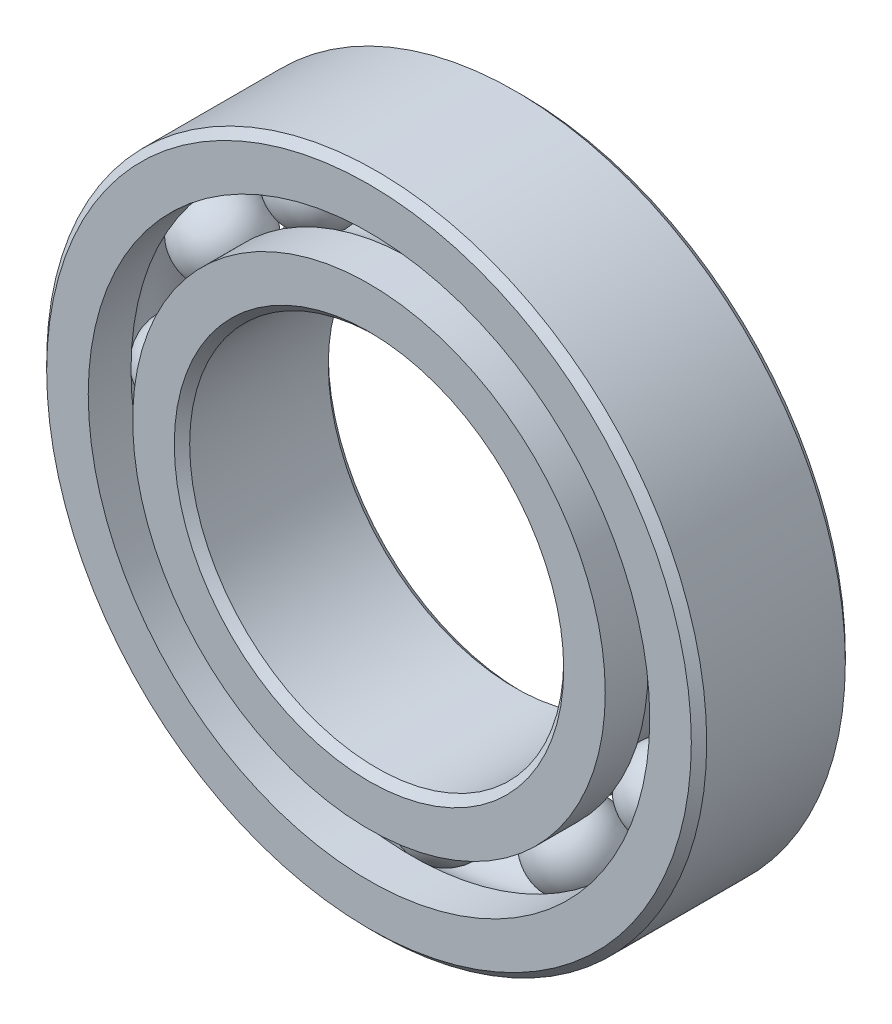
ISO-10303-21;
HEADER;
FILE_DESCRIPTION(('STEP AP214'),'2;1');
FILE_NAME('part.step','',(''),(''),'','','');
FILE_SCHEMA(('AUTOMOTIVE_DESIGN { 1 0 10303 214 1 1 1 1 }'));
ENDSEC;
DATA;
#1=APPLICATION_CONTEXT('core data for automotive mechanical design processes');
#2=APPLICATION_PROTOCOL_DEFINITION('international standard','automotive_design',2000,#1);
#3=PRODUCT_CONTEXT('',#1,'mechanical');
#4=PRODUCT('Part','Part','',(#3));
#5=PRODUCT_RELATED_PRODUCT_CATEGORY('part','',(#4));
#6=PRODUCT_DEFINITION_FORMATION('','',#4);
#7=PRODUCT_DEFINITION_CONTEXT('part definition',#1,'design');
#8=PRODUCT_DEFINITION('design','',#6,#7);
#9=PRODUCT_DEFINITION_SHAPE('','',#8);
#10=(LENGTH_UNIT() NAMED_UNIT(*) SI_UNIT(.MILLI.,.METRE.));
#11=(NAMED_UNIT(*) PLANE_ANGLE_UNIT() SI_UNIT($,.RADIAN.));
#12=(NAMED_UNIT(*) SI_UNIT($,.STERADIAN.) SOLID_ANGLE_UNIT());
#13=UNCERTAINTY_MEASURE_WITH_UNIT(LENGTH_MEASURE(1.E-05),#10,'distance_accuracy_value','');
#14=(GEOMETRIC_REPRESENTATION_CONTEXT(3) GLOBAL_UNCERTAINTY_ASSIGNED_CONTEXT((#13)) GLOBAL_UNIT_ASSIGNED_CONTEXT((#10,
#11,#12)) REPRESENTATION_CONTEXT('',''));
#15=CARTESIAN_POINT('',(0.,0.,0.));
#16=DIRECTION('',(0.,0.,1.));
#17=DIRECTION('',(1.,0.,0.));
#18=AXIS2_PLACEMENT_3D('',#15,#16,#17);
#19=CARTESIAN_POINT('',(-5.87499999999987,10.1757984944672,0.));
#20=DIRECTION('',(0.,0.,1.));
#21=DIRECTION('',(-0.499999999999989,0.866025403784445,0.));
#22=AXIS2_PLACEMENT_3D('',#19,#20,#21);
#23=SPHERICAL_SURFACE('',#22,1.85522286175011);
#24=CARTESIAN_POINT('',(-5.87499999999987,10.1757984944672,1.85522286175011));
#25=VERTEX_POINT('',#24);
#26=VERTEX_LOOP('',#25);
#27=FACE_BOUND('',#26,.T.);
#28=ADVANCED_FACE('F42',(#27),#23,.T.);
#29=CLOSED_SHELL('',(#28));
#30=MANIFOLD_SOLID_BREP('B2',#29);
#31=CARTESIAN_POINT('',(-10.1757984944671,5.87500000000012,0.));
#32=DIRECTION('',(0.,0.,1.));
#33=DIRECTION('',(-0.866025403784433,0.50000000000001,0.));
#34=AXIS2_PLACEMENT_3D('',#31,#32,#33);
#35=SPHERICAL_SURFACE('',#34,1.85522286175011);
#36=CARTESIAN_POINT('',(-10.1757984944671,5.87500000000012,1.85522286175011));
#37=VERTEX_POINT('',#36);
#38=VERTEX_LOOP('',#37);
#39=FACE_BOUND('',#38,.T.);
#40=ADVANCED_FACE('F63',(#39),#35,.T.);
#41=CLOSED_SHELL('',(#40));
#42=MANIFOLD_SOLID_BREP('B6',#41);
#43=CARTESIAN_POINT('',(-11.75,1.2307471719422E-13,0.));
#44=DIRECTION('',(0.,0.,1.));
#45=DIRECTION('',(-1.,0.,0.));
#46=AXIS2_PLACEMENT_3D('',#43,#44,#45);
#47=SPHERICAL_SURFACE('',#46,1.85522286175011);
#48=CARTESIAN_POINT('',(-11.75,1.2307471719422E-13,1.85522286175011));
#49=VERTEX_POINT('',#48);
#50=VERTEX_LOOP('',#49);
#51=FACE_BOUND('',#50,.T.);
#52=ADVANCED_FACE('F84',(#51),#47,.T.);
#53=CLOSED_SHELL('',(#52));
#54=MANIFOLD_SOLID_BREP('B38',#53);
#55=CARTESIAN_POINT('',(-10.1757984944672,-5.87499999999991,0.));
#56=DIRECTION('',(0.,0.,1.));
#57=DIRECTION('',(-0.866025403784443,-0.499999999999992,0.));
#58=AXIS2_PLACEMENT_3D('',#55,#56,#57);
#59=SPHERICAL_SURFACE('',#58,1.85522286175011);
#60=CARTESIAN_POINT('',(-10.1757984944672,-5.87499999999991,1.85522286175011));
#61=VERTEX_POINT('',#60);
#62=VERTEX_LOOP('',#61);
#63=FACE_BOUND('',#62,.T.);
#64=ADVANCED_FACE('F105',(#63),#59,.T.);
#65=CLOSED_SHELL('',(#64));
#66=MANIFOLD_SOLID_BREP('B59',#65);
#67=CARTESIAN_POINT('',(-5.87500000000008,-10.1757984944671,0.));
#68=DIRECTION('',(0.,0.,1.));
#69=DIRECTION('',(-0.500000000000007,-0.866025403784435,0.));
#70=AXIS2_PLACEMENT_3D('',#67,#68,#69);
#71=SPHERICAL_SURFACE('',#70,1.85522286175011);
#72=CARTESIAN_POINT('',(-5.87500000000008,-10.1757984944671,1.85522286175011));
#73=VERTEX_POINT('',#72);
#74=VERTEX_LOOP('',#73);
#75=FACE_BOUND('',#74,.T.);
#76=ADVANCED_FACE('F126',(#75),#71,.T.);
#77=CLOSED_SHELL('',(#76));
#78=MANIFOLD_SOLID_BREP('B80',#77);
#79=CARTESIAN_POINT('',(0.,-11.75,0.));
#80=DIRECTION('',(0.,0.,1.));
#81=DIRECTION('',(0.,-1.,0.));
#82=AXIS2_PLACEMENT_3D('',#79,#80,#81);
#83=SPHERICAL_SURFACE('',#82,1.85522286175011);
#84=CARTESIAN_POINT('',(0.,-11.75,1.85522286175011));
#85=VERTEX_POINT('',#84);
#86=VERTEX_LOOP('',#85);
#87=FACE_BOUND('',#86,.T.);
#88=ADVANCED_FACE('F147',(#87),#83,.T.);
#89=CLOSED_SHELL('',(#88));
#90=MANIFOLD_SOLID_BREP('B101',#89);
#91=CARTESIAN_POINT('',(5.87499999999994,-10.1757984944672,0.));
#92=DIRECTION('',(0.,0.,1.));
#93=DIRECTION('',(0.499999999999995,-0.866025403784442,0.));
#94=AXIS2_PLACEMENT_3D('',#91,#92,#93);
#95=SPHERICAL_SURFACE('',#94,1.85522286175011);
#96=CARTESIAN_POINT('',(5.87499999999994,-10.1757984944672,1.85522286175011));
#97=VERTEX_POINT('',#96);
#98=VERTEX_LOOP('',#97);
#99=FACE_BOUND('',#98,.T.);
#100=ADVANCED_FACE('F168',(#99),#95,.T.);
#101=CLOSED_SHELL('',(#100));
#102=MANIFOLD_SOLID_BREP('B122',#101);
#103=CARTESIAN_POINT('',(10.1757984944671,-5.87500000000005,0.));
#104=DIRECTION('',(0.,0.,1.));
#105=DIRECTION('',(0.866025403784436,-0.500000000000004,0.));
#106=AXIS2_PLACEMENT_3D('',#103,#104,#105);
#107=SPHERICAL_SURFACE('',#106,1.85522286175011);
#108=CARTESIAN_POINT('',(10.1757984944671,-5.87500000000005,1.85522286175011));
#109=VERTEX_POINT('',#108);
#110=VERTEX_LOOP('',#109);
#111=FACE_BOUND('',#110,.T.);
#112=ADVANCED_FACE('F189',(#111),#107,.T.);
#113=CLOSED_SHELL('',(#112));
#114=MANIFOLD_SOLID_BREP('B143',#113);
#115=CARTESIAN_POINT('',(11.75,0.,0.));
#116=DIRECTION('',(0.,0.,1.));
#117=DIRECTION('',(1.,0.,0.));
#118=AXIS2_PLACEMENT_3D('',#115,#116,#117);
#119=SPHERICAL_SURFACE('',#118,1.85522286175011);
#120=CARTESIAN_POINT('',(11.75,0.,1.85522286175011));
#121=VERTEX_POINT('',#120);
#122=VERTEX_LOOP('',#121);
#123=FACE_BOUND('',#122,.T.);
#124=ADVANCED_FACE('F210',(#123),#119,.T.);
#125=CLOSED_SHELL('',(#124));
#126=MANIFOLD_SOLID_BREP('B164',#125);
#127=CARTESIAN_POINT('',(10.1757984944672,5.87499999999998,0.));
#128=DIRECTION('',(0.,0.,1.));
#129=DIRECTION('',(0.86602540378444,0.499999999999998,0.));
#130=AXIS2_PLACEMENT_3D('',#127,#128,#129);
#131=SPHERICAL_SURFACE('',#130,1.85522286175011);
#132=CARTESIAN_POINT('',(10.1757984944672,5.87499999999998,1.85522286175011));
#133=VERTEX_POINT('',#132);
#134=VERTEX_LOOP('',#133);
#135=FACE_BOUND('',#134,.T.);
#136=ADVANCED_FACE('F231',(#135),#131,.T.);
#137=CLOSED_SHELL('',(#136));
#138=MANIFOLD_SOLID_BREP('B185',#137);
#139=CARTESIAN_POINT('',(5.87500000000001,10.1757984944671,0.));
#140=DIRECTION('',(0.,0.,1.));
#141=DIRECTION('',(0.500000000000001,0.866025403784438,0.));
#142=AXIS2_PLACEMENT_3D('',#139,#140,#141);
#143=SPHERICAL_SURFACE('',#142,1.85522286175011);
#144=CARTESIAN_POINT('',(5.87500000000001,10.1757984944671,1.85522286175011));
#145=VERTEX_POINT('',#144);
#146=VERTEX_LOOP('',#145);
#147=FACE_BOUND('',#146,.T.);
#148=ADVANCED_FACE('F252',(#147),#143,.T.);
#149=CLOSED_SHELL('',(#148));
#150=MANIFOLD_SOLID_BREP('B206',#149);
#151=CARTESIAN_POINT('',(0.,11.75,0.));
#152=DIRECTION('',(0.,0.,1.));
#153=DIRECTION('',(0.,1.,0.));
#154=AXIS2_PLACEMENT_3D('',#151,#152,#153);
#155=SPHERICAL_SURFACE('',#154,1.85522286175011);
#156=CARTESIAN_POINT('',(0.,11.75,1.85522286175011));
#157=VERTEX_POINT('',#156);
#158=VERTEX_LOOP('',#157);
#159=FACE_BOUND('',#158,.T.);
#160=ADVANCED_FACE('F275',(#159),#155,.T.);
#161=CLOSED_SHELL('',(#160));
#162=MANIFOLD_SOLID_BREP('B227',#161);
#163=CARTESIAN_POINT('',(0.,10.739010989011,3.5));
#164=DIRECTION('',(0.,0.,-1.));
#165=DIRECTION('',(-1.,0.,0.));
#166=AXIS2_PLACEMENT_3D('',#163,#164,#165);
#167=PLANE('',#166);
#168=CARTESIAN_POINT('',(0.,0.,3.5));
#169=DIRECTION('',(0.,0.,1.));
#170=DIRECTION('',(1.,0.,0.));
#171=AXIS2_PLACEMENT_3D('',#168,#169,#170);
#172=CIRCLE('',#171,8.85);
#173=CARTESIAN_POINT('',(8.85,0.,3.5));
#174=VERTEX_POINT('',#173);
#175=EDGE_CURVE('E323',#174,#174,#172,.T.);
#176=ORIENTED_EDGE('',*,*,#175,.F.);
#177=EDGE_LOOP('',(#176));
#178=FACE_BOUND('',#177,.T.);
#179=CARTESIAN_POINT('',(0.,0.,3.5));
#180=DIRECTION('',(0.,0.,1.));
#181=DIRECTION('',(1.,0.,0.));
#182=AXIS2_PLACEMENT_3D('',#179,#180,#181);
#183=CIRCLE('',#182,10.739010989011);
#184=CARTESIAN_POINT('',(10.739010989011,0.,3.5));
#185=VERTEX_POINT('',#184);
#186=EDGE_CURVE('E274',#185,#185,#183,.T.);
#187=ORIENTED_EDGE('',*,*,#186,.T.);
#188=EDGE_LOOP('',(#187));
#189=FACE_BOUND('',#188,.T.);
#190=ADVANCED_FACE('F295',(#178,#189),#167,.F.);
#191=CARTESIAN_POINT('',(0.,0.,3.5));
#192=DIRECTION('',(0.,0.,1.));
#193=DIRECTION('',(1.,0.,0.));
#194=AXIS2_PLACEMENT_3D('',#191,#192,#193);
#195=CYLINDRICAL_SURFACE('',#194,10.739010989011);
#196=ORIENTED_EDGE('',*,*,#186,.F.);
#197=EDGE_LOOP('',(#196));
#198=FACE_BOUND('',#197,.T.);
#199=CARTESIAN_POINT('',(0.,0.,1.55555555555555));
#200=DIRECTION('',(0.,0.,1.));
#201=DIRECTION('',(1.,0.,0.));
#202=AXIS2_PLACEMENT_3D('',#199,#200,#201);
#203=CIRCLE('',#202,10.739010989011);
#204=CARTESIAN_POINT('',(10.739010989011,0.,1.55555555555555));
#205=VERTEX_POINT('',#204);
#206=EDGE_CURVE('E301',#205,#205,#203,.T.);
#207=ORIENTED_EDGE('',*,*,#206,.T.);
#208=EDGE_LOOP('',(#207));
#209=FACE_BOUND('',#208,.T.);
#210=ADVANCED_FACE('F330',(#198,#209),#195,.T.);
#211=CARTESIAN_POINT('',(0.,0.,0.));
#212=DIRECTION('',(0.,0.,1.));
#213=DIRECTION('',(1.,0.,0.));
#214=AXIS2_PLACEMENT_3D('',#211,#212,#213);
#215=TOROIDAL_SURFACE('',#214,11.75,1.85522286175011);
#216=ORIENTED_EDGE('',*,*,#206,.F.);
#217=EDGE_LOOP('',(#216));
#218=FACE_BOUND('',#217,.T.);
#219=CARTESIAN_POINT('',(0.,0.,-1.55555555555556));
#220=DIRECTION('',(0.,0.,1.));
#221=DIRECTION('',(1.,0.,0.));
#222=AXIS2_PLACEMENT_3D('',#219,#220,#221);
#223=CIRCLE('',#222,10.739010989011);
#224=CARTESIAN_POINT('',(10.739010989011,0.,-1.55555555555556));
#225=VERTEX_POINT('',#224);
#226=EDGE_CURVE('E305',#225,#225,#223,.T.);
#227=ORIENTED_EDGE('',*,*,#226,.T.);
#228=EDGE_LOOP('',(#227));
#229=FACE_BOUND('',#228,.T.);
#230=ADVANCED_FACE('F334',(#218,#229),#215,.F.);
#231=CARTESIAN_POINT('',(0.,0.,3.5));
#232=DIRECTION('',(0.,0.,1.));
#233=DIRECTION('',(1.,0.,0.));
#234=AXIS2_PLACEMENT_3D('',#231,#232,#233);
#235=CYLINDRICAL_SURFACE('',#234,10.739010989011);
#236=ORIENTED_EDGE('',*,*,#226,.F.);
#237=EDGE_LOOP('',(#236));
#238=FACE_BOUND('',#237,.T.);
#239=CARTESIAN_POINT('',(0.,0.,-3.5));
#240=DIRECTION('',(0.,0.,1.));
#241=DIRECTION('',(1.,0.,0.));
#242=AXIS2_PLACEMENT_3D('',#239,#240,#241);
#243=CIRCLE('',#242,10.739010989011);
#244=CARTESIAN_POINT('',(10.739010989011,0.,-3.5));
#245=VERTEX_POINT('',#244);
#246=EDGE_CURVE('E309',#245,#245,#243,.T.);
#247=ORIENTED_EDGE('',*,*,#246,.T.);
#248=EDGE_LOOP('',(#247));
#249=FACE_BOUND('',#248,.T.);
#250=ADVANCED_FACE('F339',(#238,#249),#235,.T.);
#251=CARTESIAN_POINT('',(0.,8.85,-3.5));
#252=DIRECTION('',(0.,0.,1.));
#253=DIRECTION('',(1.,0.,0.));
#254=AXIS2_PLACEMENT_3D('',#251,#252,#253);
#255=PLANE('',#254);
#256=ORIENTED_EDGE('',*,*,#246,.F.);
#257=EDGE_LOOP('',(#256));
#258=FACE_BOUND('',#257,.T.);
#259=CARTESIAN_POINT('',(0.,0.,-3.5));
#260=DIRECTION('',(0.,0.,1.));
#261=DIRECTION('',(1.,0.,0.));
#262=AXIS2_PLACEMENT_3D('',#259,#260,#261);
#263=CIRCLE('',#262,8.85);
#264=CARTESIAN_POINT('',(8.85,0.,-3.5));
#265=VERTEX_POINT('',#264);
#266=EDGE_CURVE('E314',#265,#265,#263,.T.);
#267=ORIENTED_EDGE('',*,*,#266,.T.);
#268=EDGE_LOOP('',(#267));
#269=FACE_BOUND('',#268,.T.);
#270=ADVANCED_FACE('F345',(#258,#269),#255,.F.);
#271=CARTESIAN_POINT('',(0.,0.,-3.15));
#272=DIRECTION('',(0.,0.,-1.));
#273=DIRECTION('',(-1.,0.,0.));
#274=AXIS2_PLACEMENT_3D('',#271,#272,#273);
#275=CONICAL_SURFACE('',#274,8.5,0.785398163397443);
#276=ORIENTED_EDGE('',*,*,#266,.F.);
#277=EDGE_LOOP('',(#276));
#278=FACE_BOUND('',#277,.T.);
#279=CARTESIAN_POINT('',(0.,0.,-3.15));
#280=DIRECTION('',(0.,0.,1.));
#281=DIRECTION('',(1.,0.,0.));
#282=AXIS2_PLACEMENT_3D('',#279,#280,#281);
#283=CIRCLE('',#282,8.5);
#284=CARTESIAN_POINT('',(8.5,0.,-3.15));
#285=VERTEX_POINT('',#284);
#286=EDGE_CURVE('E317',#285,#285,#283,.T.);
#287=ORIENTED_EDGE('',*,*,#286,.T.);
#288=EDGE_LOOP('',(#287));
#289=FACE_BOUND('',#288,.T.);
#290=ADVANCED_FACE('F349',(#278,#289),#275,.F.);
#291=CARTESIAN_POINT('',(0.,0.,3.5));
#292=DIRECTION('',(0.,0.,1.));
#293=DIRECTION('',(1.,0.,0.));
#294=AXIS2_PLACEMENT_3D('',#291,#292,#293);
#295=CYLINDRICAL_SURFACE('',#294,8.5);
#296=ORIENTED_EDGE('',*,*,#286,.F.);
#297=EDGE_LOOP('',(#296));
#298=FACE_BOUND('',#297,.T.);
#299=CARTESIAN_POINT('',(0.,0.,3.15000000000001));
#300=DIRECTION('',(0.,0.,1.));
#301=DIRECTION('',(1.,0.,0.));
#302=AXIS2_PLACEMENT_3D('',#299,#300,#301);
#303=CIRCLE('',#302,8.5);
#304=CARTESIAN_POINT('',(8.5,0.,3.15000000000001));
#305=VERTEX_POINT('',#304);
#306=EDGE_CURVE('E320',#305,#305,#303,.T.);
#307=ORIENTED_EDGE('',*,*,#306,.T.);
#308=EDGE_LOOP('',(#307));
#309=FACE_BOUND('',#308,.T.);
#310=ADVANCED_FACE('F353',(#298,#309),#295,.F.);
#311=CARTESIAN_POINT('',(0.,0.,3.5));
#312=DIRECTION('',(0.,0.,1.));
#313=DIRECTION('',(1.,0.,0.));
#314=AXIS2_PLACEMENT_3D('',#311,#312,#313);
#315=CONICAL_SURFACE('',#314,8.85,0.785398163397457);
#316=ORIENTED_EDGE('',*,*,#306,.F.);
#317=EDGE_LOOP('',(#316));
#318=FACE_BOUND('',#317,.T.);
#319=ORIENTED_EDGE('',*,*,#175,.T.);
#320=EDGE_LOOP('',(#319));
#321=FACE_BOUND('',#320,.T.);
#322=ADVANCED_FACE('F327',(#318,#321),#315,.F.);
#323=CLOSED_SHELL('',(#190,#210,#230,#250,#270,#290,#310,#322));
#324=MANIFOLD_SOLID_BREP('B248',#323);
#325=CARTESIAN_POINT('',(0.,0.,3.15));
#326=DIRECTION('',(0.,0.,-1.));
#327=DIRECTION('',(-1.,0.,0.));
#328=AXIS2_PLACEMENT_3D('',#325,#326,#327);
#329=CONICAL_SURFACE('',#328,15.,0.785398163397445);
#330=CARTESIAN_POINT('',(0.,0.,3.5));
#331=DIRECTION('',(0.,0.,1.));
#332=DIRECTION('',(1.,0.,0.));
#333=AXIS2_PLACEMENT_3D('',#330,#331,#332);
#334=CIRCLE('',#333,14.65);
#335=CARTESIAN_POINT('',(14.65,0.,3.5));
#336=VERTEX_POINT('',#335);
#337=EDGE_CURVE('E445',#336,#336,#334,.T.);
#338=ORIENTED_EDGE('',*,*,#337,.F.);
#339=EDGE_LOOP('',(#338));
#340=FACE_BOUND('',#339,.T.);
#341=CARTESIAN_POINT('',(0.,0.,3.15));
#342=DIRECTION('',(0.,0.,1.));
#343=DIRECTION('',(1.,0.,0.));
#344=AXIS2_PLACEMENT_3D('',#341,#342,#343);
#345=CIRCLE('',#344,15.);
#346=CARTESIAN_POINT('',(15.,0.,3.15));
#347=VERTEX_POINT('',#346);
#348=EDGE_CURVE('E294',#347,#347,#345,.T.);
#349=ORIENTED_EDGE('',*,*,#348,.T.);
#350=EDGE_LOOP('',(#349));
#351=FACE_BOUND('',#350,.T.);
#352=ADVANCED_FACE('F417',(#340,#351),#329,.T.);
#353=CARTESIAN_POINT('',(0.,0.,3.5));
#354=DIRECTION('',(0.,0.,1.));
#355=DIRECTION('',(1.,0.,0.));
#356=AXIS2_PLACEMENT_3D('',#353,#354,#355);
#357=CYLINDRICAL_SURFACE('',#356,15.);
#358=ORIENTED_EDGE('',*,*,#348,.F.);
#359=EDGE_LOOP('',(#358));
#360=FACE_BOUND('',#359,.T.);
#361=CARTESIAN_POINT('',(0.,0.,-3.15));
#362=DIRECTION('',(0.,0.,1.));
#363=DIRECTION('',(1.,0.,0.));
#364=AXIS2_PLACEMENT_3D('',#361,#362,#363);
#365=CIRCLE('',#364,15.);
#366=CARTESIAN_POINT('',(15.,0.,-3.15));
#367=VERTEX_POINT('',#366);
#368=EDGE_CURVE('E423',#367,#367,#365,.T.);
#369=ORIENTED_EDGE('',*,*,#368,.T.);
#370=EDGE_LOOP('',(#369));
#371=FACE_BOUND('',#370,.T.);
#372=ADVANCED_FACE('F452',(#360,#371),#357,.T.);
#373=CARTESIAN_POINT('',(0.,0.,-3.5));
#374=DIRECTION('',(0.,0.,1.));
#375=DIRECTION('',(1.,0.,0.));
#376=AXIS2_PLACEMENT_3D('',#373,#374,#375);
#377=CONICAL_SURFACE('',#376,14.65,0.785398163397443);
#378=ORIENTED_EDGE('',*,*,#368,.F.);
#379=EDGE_LOOP('',(#378));
#380=FACE_BOUND('',#379,.T.);
#381=CARTESIAN_POINT('',(0.,0.,-3.5));
#382=DIRECTION('',(0.,0.,1.));
#383=DIRECTION('',(1.,0.,0.));
#384=AXIS2_PLACEMENT_3D('',#381,#382,#383);
#385=CIRCLE('',#384,14.65);
#386=CARTESIAN_POINT('',(14.65,0.,-3.5));
#387=VERTEX_POINT('',#386);
#388=EDGE_CURVE('E427',#387,#387,#385,.T.);
#389=ORIENTED_EDGE('',*,*,#388,.T.);
#390=EDGE_LOOP('',(#389));
#391=FACE_BOUND('',#390,.T.);
#392=ADVANCED_FACE('F456',(#380,#391),#377,.T.);
#393=CARTESIAN_POINT('',(0.,14.65,-3.5));
#394=DIRECTION('',(0.,0.,1.));
#395=DIRECTION('',(1.,0.,0.));
#396=AXIS2_PLACEMENT_3D('',#393,#394,#395);
#397=PLANE('',#396);
#398=ORIENTED_EDGE('',*,*,#388,.F.);
#399=EDGE_LOOP('',(#398));
#400=FACE_BOUND('',#399,.T.);
#401=CARTESIAN_POINT('',(0.,0.,-3.5));
#402=DIRECTION('',(0.,0.,1.));
#403=DIRECTION('',(1.,0.,0.));
#404=AXIS2_PLACEMENT_3D('',#401,#402,#403);
#405=CIRCLE('',#404,12.760989010989);
#406=CARTESIAN_POINT('',(12.760989010989,0.,-3.5));
#407=VERTEX_POINT('',#406);
#408=EDGE_CURVE('E431',#407,#407,#405,.T.);
#409=ORIENTED_EDGE('',*,*,#408,.T.);
#410=EDGE_LOOP('',(#409));
#411=FACE_BOUND('',#410,.T.);
#412=ADVANCED_FACE('F461',(#400,#411),#397,.F.);
#413=CARTESIAN_POINT('',(0.,0.,3.5));
#414=DIRECTION('',(0.,0.,1.));
#415=DIRECTION('',(1.,0.,0.));
#416=AXIS2_PLACEMENT_3D('',#413,#414,#415);
#417=CYLINDRICAL_SURFACE('',#416,12.760989010989);
#418=ORIENTED_EDGE('',*,*,#408,.F.);
#419=EDGE_LOOP('',(#418));
#420=FACE_BOUND('',#419,.T.);
#421=CARTESIAN_POINT('',(0.,0.,-1.55555555555556));
#422=DIRECTION('',(0.,0.,1.));
#423=DIRECTION('',(1.,0.,0.));
#424=AXIS2_PLACEMENT_3D('',#421,#422,#423);
#425=CIRCLE('',#424,12.760989010989);
#426=CARTESIAN_POINT('',(12.760989010989,0.,-1.55555555555556));
#427=VERTEX_POINT('',#426);
#428=EDGE_CURVE('E436',#427,#427,#425,.T.);
#429=ORIENTED_EDGE('',*,*,#428,.T.);
#430=EDGE_LOOP('',(#429));
#431=FACE_BOUND('',#430,.T.);
#432=ADVANCED_FACE('F467',(#420,#431),#417,.F.);
#433=CARTESIAN_POINT('',(0.,0.,0.));
#434=DIRECTION('',(0.,0.,1.));
#435=DIRECTION('',(1.,0.,0.));
#436=AXIS2_PLACEMENT_3D('',#433,#434,#435);
#437=TOROIDAL_SURFACE('',#436,11.75,1.85522286175012);
#438=ORIENTED_EDGE('',*,*,#428,.F.);
#439=EDGE_LOOP('',(#438));
#440=FACE_BOUND('',#439,.T.);
#441=CARTESIAN_POINT('',(0.,0.,1.55555555555555));
#442=DIRECTION('',(0.,0.,1.));
#443=DIRECTION('',(1.,0.,0.));
#444=AXIS2_PLACEMENT_3D('',#441,#442,#443);
#445=CIRCLE('',#444,12.760989010989);
#446=CARTESIAN_POINT('',(12.760989010989,0.,1.55555555555555));
#447=VERTEX_POINT('',#446);
#448=EDGE_CURVE('E439',#447,#447,#445,.T.);
#449=ORIENTED_EDGE('',*,*,#448,.T.);
#450=EDGE_LOOP('',(#449));
#451=FACE_BOUND('',#450,.T.);
#452=ADVANCED_FACE('F471',(#440,#451),#437,.F.);
#453=CARTESIAN_POINT('',(0.,0.,3.5));
#454=DIRECTION('',(0.,0.,1.));
#455=DIRECTION('',(1.,0.,0.));
#456=AXIS2_PLACEMENT_3D('',#453,#454,#455);
#457=CYLINDRICAL_SURFACE('',#456,12.760989010989);
#458=ORIENTED_EDGE('',*,*,#448,.F.);
#459=EDGE_LOOP('',(#458));
#460=FACE_BOUND('',#459,.T.);
#461=CARTESIAN_POINT('',(0.,0.,3.5));
#462=DIRECTION('',(0.,0.,1.));
#463=DIRECTION('',(1.,0.,0.));
#464=AXIS2_PLACEMENT_3D('',#461,#462,#463);
#465=CIRCLE('',#464,12.760989010989);
#466=CARTESIAN_POINT('',(12.760989010989,0.,3.5));
#467=VERTEX_POINT('',#466);
#468=EDGE_CURVE('E442',#467,#467,#465,.T.);
#469=ORIENTED_EDGE('',*,*,#468,.T.);
#470=EDGE_LOOP('',(#469));
#471=FACE_BOUND('',#470,.T.);
#472=ADVANCED_FACE('F475',(#460,#471),#457,.F.);
#473=CARTESIAN_POINT('',(0.,14.65,3.5));
#474=DIRECTION('',(0.,0.,-1.));
#475=DIRECTION('',(-1.,0.,0.));
#476=AXIS2_PLACEMENT_3D('',#473,#474,#475);
#477=PLANE('',#476);
#478=ORIENTED_EDGE('',*,*,#468,.F.);
#479=EDGE_LOOP('',(#478));
#480=FACE_BOUND('',#479,.T.);
#481=ORIENTED_EDGE('',*,*,#337,.T.);
#482=EDGE_LOOP('',(#481));
#483=FACE_BOUND('',#482,.T.);
#484=ADVANCED_FACE('F449',(#480,#483),#477,.F.);
#485=CLOSED_SHELL('',(#352,#372,#392,#412,#432,#452,#472,#484));
#486=MANIFOLD_SOLID_BREP('B269',#485);
#487=ADVANCED_BREP_SHAPE_REPRESENTATION('',(#18,#30,#42,#54,#66,#78,#90,#102,#114,#126,#138,
#150,#162,#324,#486),#14);
#488=SHAPE_DEFINITION_REPRESENTATION(#9,#487);
ENDSEC;
END-ISO-10303-21;
